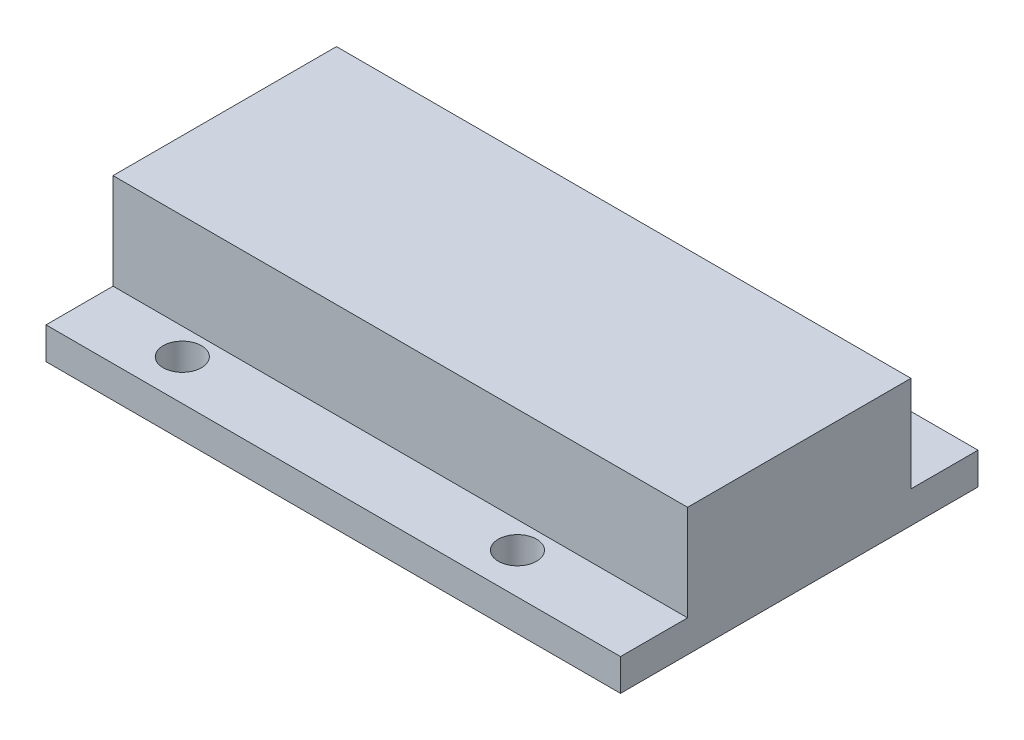
ISO-10303-21;
HEADER;
FILE_DESCRIPTION(('STEP AP214'),'2;1');
FILE_NAME('part.step','',(''),(''),'','','');
FILE_SCHEMA(('AUTOMOTIVE_DESIGN { 1 0 10303 214 1 1 1 1 }'));
ENDSEC;
DATA;
#1=APPLICATION_CONTEXT('core data for automotive mechanical design processes');
#2=APPLICATION_PROTOCOL_DEFINITION('international standard','automotive_design',2000,#1);
#3=PRODUCT_CONTEXT('',#1,'mechanical');
#4=PRODUCT('Part','Part','',(#3));
#5=PRODUCT_RELATED_PRODUCT_CATEGORY('part','',(#4));
#6=PRODUCT_DEFINITION_FORMATION('','',#4);
#7=PRODUCT_DEFINITION_CONTEXT('part definition',#1,'design');
#8=PRODUCT_DEFINITION('design','',#6,#7);
#9=PRODUCT_DEFINITION_SHAPE('','',#8);
#10=(LENGTH_UNIT() NAMED_UNIT(*) SI_UNIT(.MILLI.,.METRE.));
#11=(NAMED_UNIT(*) PLANE_ANGLE_UNIT() SI_UNIT($,.RADIAN.));
#12=(NAMED_UNIT(*) SI_UNIT($,.STERADIAN.) SOLID_ANGLE_UNIT());
#13=UNCERTAINTY_MEASURE_WITH_UNIT(LENGTH_MEASURE(1.E-05),#10,'distance_accuracy_value','');
#14=(GEOMETRIC_REPRESENTATION_CONTEXT(3) GLOBAL_UNCERTAINTY_ASSIGNED_CONTEXT((#13)) GLOBAL_UNIT_ASSIGNED_CONTEXT((#10,
#11,#12)) REPRESENTATION_CONTEXT('',''));
#15=CARTESIAN_POINT('',(0.,0.,0.));
#16=DIRECTION('',(0.,0.,1.));
#17=DIRECTION('',(1.,0.,0.));
#18=AXIS2_PLACEMENT_3D('',#15,#16,#17);
#19=CARTESIAN_POINT('',(-5.,0.,0.));
#20=DIRECTION('',(1.,0.,0.));
#21=DIRECTION('',(0.,0.,-1.));
#22=AXIS2_PLACEMENT_3D('',#19,#20,#21);
#23=CYLINDRICAL_SURFACE('',#22,1.5);
#24=CARTESIAN_POINT('',(-1.,0.,0.));
#25=DIRECTION('',(1.,0.,0.));
#26=DIRECTION('',(0.,0.,-1.));
#27=AXIS2_PLACEMENT_3D('',#24,#25,#26);
#28=CIRCLE('',#27,1.5);
#29=CARTESIAN_POINT('',(-1.,0.,-1.5));
#30=VERTEX_POINT('',#29);
#31=CARTESIAN_POINT('',(-1.,0.,1.5));
#32=VERTEX_POINT('',#31);
#33=EDGE_CURVE('E58',#30,#32,#28,.T.);
#34=ORIENTED_EDGE('',*,*,#33,.T.);
#35=DIRECTION('',(1.,0.,0.));
#36=VECTOR('',#35,1.);
#37=CARTESIAN_POINT('',(-5.,0.,1.5));
#38=LINE('',#37,#36);
#39=CARTESIAN_POINT('',(-5.,0.,1.5));
#40=VERTEX_POINT('',#39);
#41=EDGE_CURVE('E132',#40,#32,#38,.T.);
#42=ORIENTED_EDGE('',*,*,#41,.F.);
#43=CARTESIAN_POINT('',(-5.,0.,0.));
#44=DIRECTION('',(1.,0.,0.));
#45=DIRECTION('',(0.,0.,-1.));
#46=AXIS2_PLACEMENT_3D('',#43,#44,#45);
#47=CIRCLE('',#46,1.5);
#48=CARTESIAN_POINT('',(-5.,0.,-1.5));
#49=VERTEX_POINT('',#48);
#50=EDGE_CURVE('E135',#49,#40,#47,.T.);
#51=ORIENTED_EDGE('',*,*,#50,.F.);
#52=DIRECTION('',(1.,0.,0.));
#53=VECTOR('',#52,1.);
#54=CARTESIAN_POINT('',(-5.,0.,-1.5));
#55=LINE('',#54,#53);
#56=EDGE_CURVE('E53',#49,#30,#55,.T.);
#57=ORIENTED_EDGE('',*,*,#56,.T.);
#58=EDGE_LOOP('',(#34,#42,#51,#57));
#59=FACE_BOUND('',#58,.T.);
#60=ADVANCED_FACE('F36',(#59),#23,.F.);
#61=CARTESIAN_POINT('',(-18.,0.,0.));
#62=DIRECTION('',(1.,0.,0.));
#63=DIRECTION('',(0.,0.,-1.));
#64=AXIS2_PLACEMENT_3D('',#61,#62,#63);
#65=CYLINDRICAL_SURFACE('',#64,3.1);
#66=CARTESIAN_POINT('',(-5.,0.,0.));
#67=DIRECTION('',(1.,0.,0.));
#68=DIRECTION('',(0.,0.,-1.));
#69=AXIS2_PLACEMENT_3D('',#66,#67,#68);
#70=CIRCLE('',#69,3.1);
#71=CARTESIAN_POINT('',(-5.,0.,-3.1));
#72=VERTEX_POINT('',#71);
#73=CARTESIAN_POINT('',(-5.,0.,3.1));
#74=VERTEX_POINT('',#73);
#75=EDGE_CURVE('E142',#72,#74,#70,.T.);
#76=ORIENTED_EDGE('',*,*,#75,.T.);
#77=DIRECTION('',(1.,0.,0.));
#78=VECTOR('',#77,1.);
#79=CARTESIAN_POINT('',(-18.,0.,3.1));
#80=LINE('',#79,#78);
#81=CARTESIAN_POINT('',(-18.,0.,3.1));
#82=VERTEX_POINT('',#81);
#83=EDGE_CURVE('E11',#82,#74,#80,.T.);
#84=ORIENTED_EDGE('',*,*,#83,.F.);
#85=CARTESIAN_POINT('',(-18.,0.,0.));
#86=DIRECTION('',(1.,0.,0.));
#87=DIRECTION('',(0.,0.,-1.));
#88=AXIS2_PLACEMENT_3D('',#85,#86,#87);
#89=CIRCLE('',#88,3.1);
#90=CARTESIAN_POINT('',(-18.,0.,-3.1));
#91=VERTEX_POINT('',#90);
#92=EDGE_CURVE('E151',#91,#82,#89,.T.);
#93=ORIENTED_EDGE('',*,*,#92,.F.);
#94=DIRECTION('',(1.,0.,0.));
#95=VECTOR('',#94,1.);
#96=CARTESIAN_POINT('',(-18.,0.,-3.1));
#97=LINE('',#96,#95);
#98=EDGE_CURVE('E153',#91,#72,#97,.T.);
#99=ORIENTED_EDGE('',*,*,#98,.T.);
#100=EDGE_LOOP('',(#76,#84,#93,#99));
#101=FACE_BOUND('',#100,.T.);
#102=ADVANCED_FACE('F38',(#101),#65,.F.);
#103=CARTESIAN_POINT('',(-18.,0.,0.));
#104=DIRECTION('',(0.,-1.,0.));
#105=DIRECTION('',(0.,0.,-1.));
#106=AXIS2_PLACEMENT_3D('',#103,#104,#105);
#107=PLANE('',#106);
#108=CARTESIAN_POINT('',(-15.,0.,4.32953494659146));
#109=DIRECTION('',(0.,-1.,0.));
#110=DIRECTION('',(0.,0.,-1.));
#111=AXIS2_PLACEMENT_3D('',#108,#109,#110);
#112=CIRCLE('',#111,0.6);
#113=CARTESIAN_POINT('',(-15.,0.,3.72953494659146));
#114=VERTEX_POINT('',#113);
#115=EDGE_CURVE('E168',#114,#114,#112,.T.);
#116=ORIENTED_EDGE('',*,*,#115,.F.);
#117=EDGE_LOOP('',(#116));
#118=FACE_BOUND('',#117,.T.);
#119=CARTESIAN_POINT('',(-4.5,0.,4.32953494659146));
#120=DIRECTION('',(0.,-1.,0.));
#121=DIRECTION('',(0.,0.,-1.));
#122=AXIS2_PLACEMENT_3D('',#119,#120,#121);
#123=CIRCLE('',#122,0.6);
#124=CARTESIAN_POINT('',(-4.5,0.,3.72953494659146));
#125=VERTEX_POINT('',#124);
#126=EDGE_CURVE('E181',#125,#125,#123,.T.);
#127=ORIENTED_EDGE('',*,*,#126,.F.);
#128=EDGE_LOOP('',(#127));
#129=FACE_BOUND('',#128,.T.);
#130=CARTESIAN_POINT('',(-9.00000000000001,0.,-4.42046505340854));
#131=DIRECTION('',(0.,-1.,0.));
#132=DIRECTION('',(0.,0.,-1.));
#133=AXIS2_PLACEMENT_3D('',#130,#131,#132);
#134=CIRCLE('',#133,0.6);
#135=CARTESIAN_POINT('',(-9.00000000000001,0.,-5.02046505340854));
#136=VERTEX_POINT('',#135);
#137=EDGE_CURVE('E178',#136,#136,#134,.T.);
#138=ORIENTED_EDGE('',*,*,#137,.F.);
#139=EDGE_LOOP('',(#138));
#140=FACE_BOUND('',#139,.T.);
#141=DIRECTION('',(0.,0.,-1.));
#142=VECTOR('',#141,1.);
#143=CARTESIAN_POINT('',(0.,0.,0.));
#144=LINE('',#143,#142);
#145=CARTESIAN_POINT('',(0.,0.,5.6));
#146=VERTEX_POINT('',#145);
#147=CARTESIAN_POINT('',(0.,0.,-5.6));
#148=VERTEX_POINT('',#147);
#149=EDGE_CURVE('E233',#146,#148,#144,.T.);
#150=ORIENTED_EDGE('',*,*,#149,.F.);
#151=DIRECTION('',(1.,0.,0.));
#152=VECTOR('',#151,1.);
#153=CARTESIAN_POINT('',(-18.,0.,5.6));
#154=LINE('',#153,#152);
#155=CARTESIAN_POINT('',(-18.,0.,5.6));
#156=VERTEX_POINT('',#155);
#157=EDGE_CURVE('E45',#156,#146,#154,.T.);
#158=ORIENTED_EDGE('',*,*,#157,.F.);
#159=DIRECTION('',(0.,0.,-1.));
#160=VECTOR('',#159,1.);
#161=CARTESIAN_POINT('',(-18.,0.,0.));
#162=LINE('',#161,#160);
#163=EDGE_CURVE('E148',#156,#82,#162,.T.);
#164=ORIENTED_EDGE('',*,*,#163,.T.);
#165=ORIENTED_EDGE('',*,*,#83,.T.);
#166=DIRECTION('',(0.,0.,-1.));
#167=VECTOR('',#166,1.);
#168=CARTESIAN_POINT('',(-5.,0.,0.));
#169=LINE('',#168,#167);
#170=EDGE_CURVE('E133',#74,#40,#169,.T.);
#171=ORIENTED_EDGE('',*,*,#170,.T.);
#172=ORIENTED_EDGE('',*,*,#41,.T.);
#173=DIRECTION('',(0.,0.,-1.));
#174=VECTOR('',#173,1.);
#175=CARTESIAN_POINT('',(-1.,0.,0.));
#176=LINE('',#175,#174);
#177=EDGE_CURVE('E131',#32,#30,#176,.T.);
#178=ORIENTED_EDGE('',*,*,#177,.T.);
#179=ORIENTED_EDGE('',*,*,#56,.F.);
#180=EDGE_CURVE('E129',#49,#72,#169,.T.);
#181=ORIENTED_EDGE('',*,*,#180,.T.);
#182=ORIENTED_EDGE('',*,*,#98,.F.);
#183=CARTESIAN_POINT('',(-18.,0.,-5.6));
#184=VERTEX_POINT('',#183);
#185=EDGE_CURVE('E162',#91,#184,#162,.T.);
#186=ORIENTED_EDGE('',*,*,#185,.T.);
#187=DIRECTION('',(1.,0.,0.));
#188=VECTOR('',#187,1.);
#189=CARTESIAN_POINT('',(-18.,0.,-5.6));
#190=LINE('',#189,#188);
#191=EDGE_CURVE('E155',#184,#148,#190,.T.);
#192=ORIENTED_EDGE('',*,*,#191,.T.);
#193=EDGE_LOOP('',(#150,#158,#164,#165,#171,#172,#178,#179,#181,#182,#186,#192));
#194=FACE_BOUND('',#193,.T.);
#195=ADVANCED_FACE('F127',(#118,#129,#140,#194),#107,.T.);
#196=CARTESIAN_POINT('',(-18.,0.,5.6));
#197=DIRECTION('',(0.,0.,-1.));
#198=DIRECTION('',(-1.,0.,0.));
#199=AXIS2_PLACEMENT_3D('',#196,#197,#198);
#200=PLANE('',#199);
#201=DIRECTION('',(0.,1.,0.));
#202=VECTOR('',#201,1.);
#203=CARTESIAN_POINT('',(0.,0.,5.6));
#204=LINE('',#203,#202);
#205=CARTESIAN_POINT('',(0.,1.,5.6));
#206=VERTEX_POINT('',#205);
#207=EDGE_CURVE('E248',#146,#206,#204,.T.);
#208=ORIENTED_EDGE('',*,*,#207,.T.);
#209=DIRECTION('',(1.,0.,0.));
#210=VECTOR('',#209,1.);
#211=CARTESIAN_POINT('',(-18.,1.,5.6));
#212=LINE('',#211,#210);
#213=CARTESIAN_POINT('',(-18.,1.,5.6));
#214=VERTEX_POINT('',#213);
#215=EDGE_CURVE('E251',#214,#206,#212,.T.);
#216=ORIENTED_EDGE('',*,*,#215,.F.);
#217=DIRECTION('',(0.,1.,0.));
#218=VECTOR('',#217,1.);
#219=CARTESIAN_POINT('',(-18.,0.,5.6));
#220=LINE('',#219,#218);
#221=EDGE_CURVE('E160',#156,#214,#220,.T.);
#222=ORIENTED_EDGE('',*,*,#221,.F.);
#223=ORIENTED_EDGE('',*,*,#157,.T.);
#224=EDGE_LOOP('',(#208,#216,#222,#223));
#225=FACE_BOUND('',#224,.T.);
#226=ADVANCED_FACE('F192',(#225),#200,.F.);
#227=CARTESIAN_POINT('',(-18.,1.,0.));
#228=DIRECTION('',(0.,-1.,0.));
#229=DIRECTION('',(0.,0.,-1.));
#230=AXIS2_PLACEMENT_3D('',#227,#228,#229);
#231=PLANE('',#230);
#232=CARTESIAN_POINT('',(-15.,1.,4.32953494659146));
#233=DIRECTION('',(0.,-1.,0.));
#234=DIRECTION('',(0.,0.,-1.));
#235=AXIS2_PLACEMENT_3D('',#232,#233,#234);
#236=CIRCLE('',#235,0.6);
#237=CARTESIAN_POINT('',(-15.,1.,3.72953494659146));
#238=VERTEX_POINT('',#237);
#239=EDGE_CURVE('E40',#238,#238,#236,.T.);
#240=ORIENTED_EDGE('',*,*,#239,.T.);
#241=EDGE_LOOP('',(#240));
#242=FACE_BOUND('',#241,.T.);
#243=CARTESIAN_POINT('',(-4.5,1.,4.32953494659146));
#244=DIRECTION('',(0.,-1.,0.));
#245=DIRECTION('',(0.,0.,-1.));
#246=AXIS2_PLACEMENT_3D('',#243,#244,#245);
#247=CIRCLE('',#246,0.6);
#248=CARTESIAN_POINT('',(-4.5,1.,3.72953494659146));
#249=VERTEX_POINT('',#248);
#250=EDGE_CURVE('E167',#249,#249,#247,.T.);
#251=ORIENTED_EDGE('',*,*,#250,.T.);
#252=EDGE_LOOP('',(#251));
#253=FACE_BOUND('',#252,.T.);
#254=DIRECTION('',(0.,0.,-1.));
#255=VECTOR('',#254,1.);
#256=CARTESIAN_POINT('',(0.,1.,0.));
#257=LINE('',#256,#255);
#258=CARTESIAN_POINT('',(0.,1.,3.5));
#259=VERTEX_POINT('',#258);
#260=EDGE_CURVE('E245',#206,#259,#257,.T.);
#261=ORIENTED_EDGE('',*,*,#260,.T.);
#262=DIRECTION('',(1.,0.,0.));
#263=VECTOR('',#262,1.);
#264=CARTESIAN_POINT('',(-18.,1.,3.5));
#265=LINE('',#264,#263);
#266=CARTESIAN_POINT('',(-18.,1.,3.5));
#267=VERTEX_POINT('',#266);
#268=EDGE_CURVE('E254',#267,#259,#265,.T.);
#269=ORIENTED_EDGE('',*,*,#268,.F.);
#270=DIRECTION('',(0.,0.,-1.));
#271=VECTOR('',#270,1.);
#272=CARTESIAN_POINT('',(-18.,1.,0.));
#273=LINE('',#272,#271);
#274=EDGE_CURVE('E292',#214,#267,#273,.T.);
#275=ORIENTED_EDGE('',*,*,#274,.F.);
#276=ORIENTED_EDGE('',*,*,#215,.T.);
#277=EDGE_LOOP('',(#261,#269,#275,#276));
#278=FACE_BOUND('',#277,.T.);
#279=ADVANCED_FACE('F278',(#242,#253,#278),#231,.F.);
#280=CARTESIAN_POINT('',(-18.,0.,3.5));
#281=DIRECTION('',(0.,0.,1.));
#282=DIRECTION('',(0.,-1.,0.));
#283=AXIS2_PLACEMENT_3D('',#280,#281,#282);
#284=PLANE('',#283);
#285=DIRECTION('',(0.,-1.,0.));
#286=VECTOR('',#285,1.);
#287=CARTESIAN_POINT('',(0.,0.,3.5));
#288=LINE('',#287,#286);
#289=CARTESIAN_POINT('',(0.,4.,3.5));
#290=VERTEX_POINT('',#289);
#291=EDGE_CURVE('E242',#290,#259,#288,.T.);
#292=ORIENTED_EDGE('',*,*,#291,.F.);
#293=DIRECTION('',(1.,0.,0.));
#294=VECTOR('',#293,1.);
#295=CARTESIAN_POINT('',(-18.,4.,3.5));
#296=LINE('',#295,#294);
#297=CARTESIAN_POINT('',(-18.,4.,3.5));
#298=VERTEX_POINT('',#297);
#299=EDGE_CURVE('E256',#298,#290,#296,.T.);
#300=ORIENTED_EDGE('',*,*,#299,.F.);
#301=DIRECTION('',(0.,-1.,0.));
#302=VECTOR('',#301,1.);
#303=CARTESIAN_POINT('',(-18.,0.,3.5));
#304=LINE('',#303,#302);
#305=EDGE_CURVE('E275',#298,#267,#304,.T.);
#306=ORIENTED_EDGE('',*,*,#305,.T.);
#307=ORIENTED_EDGE('',*,*,#268,.T.);
#308=EDGE_LOOP('',(#292,#300,#306,#307));
#309=FACE_BOUND('',#308,.T.);
#310=ADVANCED_FACE('F271',(#309),#284,.T.);
#311=CARTESIAN_POINT('',(-18.,4.,0.));
#312=DIRECTION('',(0.,-1.,0.));
#313=DIRECTION('',(0.,0.,-1.));
#314=AXIS2_PLACEMENT_3D('',#311,#312,#313);
#315=PLANE('',#314);
#316=DIRECTION('',(0.,0.,-1.));
#317=VECTOR('',#316,1.);
#318=CARTESIAN_POINT('',(0.,4.,0.));
#319=LINE('',#318,#317);
#320=CARTESIAN_POINT('',(0.,4.,-3.5));
#321=VERTEX_POINT('',#320);
#322=EDGE_CURVE('E240',#290,#321,#319,.T.);
#323=ORIENTED_EDGE('',*,*,#322,.T.);
#324=DIRECTION('',(1.,0.,0.));
#325=VECTOR('',#324,1.);
#326=CARTESIAN_POINT('',(-18.,4.,-3.5));
#327=LINE('',#326,#325);
#328=CARTESIAN_POINT('',(-18.,4.,-3.5));
#329=VERTEX_POINT('',#328);
#330=EDGE_CURVE('E258',#329,#321,#327,.T.);
#331=ORIENTED_EDGE('',*,*,#330,.F.);
#332=DIRECTION('',(0.,0.,-1.));
#333=VECTOR('',#332,1.);
#334=CARTESIAN_POINT('',(-18.,4.,0.));
#335=LINE('',#334,#333);
#336=EDGE_CURVE('E289',#298,#329,#335,.T.);
#337=ORIENTED_EDGE('',*,*,#336,.F.);
#338=ORIENTED_EDGE('',*,*,#299,.T.);
#339=EDGE_LOOP('',(#323,#331,#337,#338));
#340=FACE_BOUND('',#339,.T.);
#341=ADVANCED_FACE('F399',(#340),#315,.F.);
#342=CARTESIAN_POINT('',(-18.,0.,-3.5));
#343=DIRECTION('',(0.,0.,1.));
#344=DIRECTION('',(0.,-1.,0.));
#345=AXIS2_PLACEMENT_3D('',#342,#343,#344);
#346=PLANE('',#345);
#347=DIRECTION('',(0.,-1.,0.));
#348=VECTOR('',#347,1.);
#349=CARTESIAN_POINT('',(0.,0.,-3.5));
#350=LINE('',#349,#348);
#351=CARTESIAN_POINT('',(0.,1.,-3.5));
#352=VERTEX_POINT('',#351);
#353=EDGE_CURVE('E224',#321,#352,#350,.T.);
#354=ORIENTED_EDGE('',*,*,#353,.T.);
#355=DIRECTION('',(1.,0.,0.));
#356=VECTOR('',#355,1.);
#357=CARTESIAN_POINT('',(-18.,1.,-3.5));
#358=LINE('',#357,#356);
#359=CARTESIAN_POINT('',(-18.,1.,-3.5));
#360=VERTEX_POINT('',#359);
#361=EDGE_CURVE('E220',#360,#352,#358,.T.);
#362=ORIENTED_EDGE('',*,*,#361,.F.);
#363=DIRECTION('',(0.,-1.,0.));
#364=VECTOR('',#363,1.);
#365=CARTESIAN_POINT('',(-18.,0.,-3.5));
#366=LINE('',#365,#364);
#367=EDGE_CURVE('E264',#329,#360,#366,.T.);
#368=ORIENTED_EDGE('',*,*,#367,.F.);
#369=ORIENTED_EDGE('',*,*,#330,.T.);
#370=EDGE_LOOP('',(#354,#362,#368,#369));
#371=FACE_BOUND('',#370,.T.);
#372=ADVANCED_FACE('F210',(#371),#346,.F.);
#373=CARTESIAN_POINT('',(-18.,0.999999999999997,0.));
#374=DIRECTION('',(0.,-1.,0.));
#375=DIRECTION('',(0.,0.,-1.));
#376=AXIS2_PLACEMENT_3D('',#373,#374,#375);
#377=PLANE('',#376);
#378=CARTESIAN_POINT('',(-9.00000000000001,1.,-4.42046505340854));
#379=DIRECTION('',(0.,-1.,0.));
#380=DIRECTION('',(0.,0.,-1.));
#381=AXIS2_PLACEMENT_3D('',#378,#379,#380);
#382=CIRCLE('',#381,0.6);
#383=CARTESIAN_POINT('',(-9.00000000000001,1.,-5.02046505340854));
#384=VERTEX_POINT('',#383);
#385=EDGE_CURVE('E165',#384,#384,#382,.T.);
#386=ORIENTED_EDGE('',*,*,#385,.T.);
#387=EDGE_LOOP('',(#386));
#388=FACE_BOUND('',#387,.T.);
#389=DIRECTION('',(0.,0.,-1.));
#390=VECTOR('',#389,1.);
#391=CARTESIAN_POINT('',(0.,0.999999999999997,0.));
#392=LINE('',#391,#390);
#393=CARTESIAN_POINT('',(0.,1.,-5.6));
#394=VERTEX_POINT('',#393);
#395=EDGE_CURVE('E215',#352,#394,#392,.T.);
#396=ORIENTED_EDGE('',*,*,#395,.T.);
#397=DIRECTION('',(1.,0.,0.));
#398=VECTOR('',#397,1.);
#399=CARTESIAN_POINT('',(-18.,1.,-5.6));
#400=LINE('',#399,#398);
#401=CARTESIAN_POINT('',(-18.,1.,-5.6));
#402=VERTEX_POINT('',#401);
#403=EDGE_CURVE('E158',#402,#394,#400,.T.);
#404=ORIENTED_EDGE('',*,*,#403,.F.);
#405=DIRECTION('',(0.,0.,-1.));
#406=VECTOR('',#405,1.);
#407=CARTESIAN_POINT('',(-18.,0.999999999999997,0.));
#408=LINE('',#407,#406);
#409=EDGE_CURVE('E286',#360,#402,#408,.T.);
#410=ORIENTED_EDGE('',*,*,#409,.F.);
#411=ORIENTED_EDGE('',*,*,#361,.T.);
#412=EDGE_LOOP('',(#396,#404,#410,#411));
#413=FACE_BOUND('',#412,.T.);
#414=ADVANCED_FACE('F206',(#388,#413),#377,.F.);
#415=CARTESIAN_POINT('',(-18.,0.,-5.6));
#416=DIRECTION('',(0.,0.,1.));
#417=DIRECTION('',(1.,0.,0.));
#418=AXIS2_PLACEMENT_3D('',#415,#416,#417);
#419=PLANE('',#418);
#420=DIRECTION('',(0.,-1.,0.));
#421=VECTOR('',#420,1.);
#422=CARTESIAN_POINT('',(0.,0.,-5.6));
#423=LINE('',#422,#421);
#424=EDGE_CURVE('E225',#394,#148,#423,.T.);
#425=ORIENTED_EDGE('',*,*,#424,.T.);
#426=ORIENTED_EDGE('',*,*,#191,.F.);
#427=DIRECTION('',(0.,-1.,0.));
#428=VECTOR('',#427,1.);
#429=CARTESIAN_POINT('',(-18.,0.,-5.6));
#430=LINE('',#429,#428);
#431=EDGE_CURVE('E230',#402,#184,#430,.T.);
#432=ORIENTED_EDGE('',*,*,#431,.F.);
#433=ORIENTED_EDGE('',*,*,#403,.T.);
#434=EDGE_LOOP('',(#425,#426,#432,#433));
#435=FACE_BOUND('',#434,.T.);
#436=ADVANCED_FACE('F209',(#435),#419,.F.);
#437=CARTESIAN_POINT('',(-18.,0.,0.));
#438=DIRECTION('',(1.,0.,0.));
#439=DIRECTION('',(0.,0.,-1.));
#440=AXIS2_PLACEMENT_3D('',#437,#438,#439);
#441=PLANE('',#440);
#442=ORIENTED_EDGE('',*,*,#92,.T.);
#443=ORIENTED_EDGE('',*,*,#163,.F.);
#444=ORIENTED_EDGE('',*,*,#221,.T.);
#445=ORIENTED_EDGE('',*,*,#274,.T.);
#446=ORIENTED_EDGE('',*,*,#305,.F.);
#447=ORIENTED_EDGE('',*,*,#336,.T.);
#448=ORIENTED_EDGE('',*,*,#367,.T.);
#449=ORIENTED_EDGE('',*,*,#409,.T.);
#450=ORIENTED_EDGE('',*,*,#431,.T.);
#451=ORIENTED_EDGE('',*,*,#185,.F.);
#452=EDGE_LOOP('',(#442,#443,#444,#445,#446,#447,#448,#449,#450,#451));
#453=FACE_BOUND('',#452,.T.);
#454=ADVANCED_FACE('F293',(#453),#441,.F.);
#455=CARTESIAN_POINT('',(0.,0.,0.));
#456=DIRECTION('',(1.,0.,0.));
#457=DIRECTION('',(0.,0.,-1.));
#458=AXIS2_PLACEMENT_3D('',#455,#456,#457);
#459=PLANE('',#458);
#460=ORIENTED_EDGE('',*,*,#149,.T.);
#461=ORIENTED_EDGE('',*,*,#424,.F.);
#462=ORIENTED_EDGE('',*,*,#395,.F.);
#463=ORIENTED_EDGE('',*,*,#353,.F.);
#464=ORIENTED_EDGE('',*,*,#322,.F.);
#465=ORIENTED_EDGE('',*,*,#291,.T.);
#466=ORIENTED_EDGE('',*,*,#260,.F.);
#467=ORIENTED_EDGE('',*,*,#207,.F.);
#468=EDGE_LOOP('',(#460,#461,#462,#463,#464,#465,#466,#467));
#469=FACE_BOUND('',#468,.T.);
#470=ADVANCED_FACE('F231',(#469),#459,.T.);
#471=CARTESIAN_POINT('',(-5.,0.,0.));
#472=DIRECTION('',(1.,0.,0.));
#473=DIRECTION('',(0.,0.,-1.));
#474=AXIS2_PLACEMENT_3D('',#471,#472,#473);
#475=PLANE('',#474);
#476=ORIENTED_EDGE('',*,*,#50,.T.);
#477=ORIENTED_EDGE('',*,*,#170,.F.);
#478=ORIENTED_EDGE('',*,*,#75,.F.);
#479=ORIENTED_EDGE('',*,*,#180,.F.);
#480=EDGE_LOOP('',(#476,#477,#478,#479));
#481=FACE_BOUND('',#480,.T.);
#482=ADVANCED_FACE('F141',(#481),#475,.F.);
#483=CARTESIAN_POINT('',(-1.,0.,0.));
#484=DIRECTION('',(1.,0.,0.));
#485=DIRECTION('',(0.,0.,-1.));
#486=AXIS2_PLACEMENT_3D('',#483,#484,#485);
#487=PLANE('',#486);
#488=ORIENTED_EDGE('',*,*,#177,.F.);
#489=ORIENTED_EDGE('',*,*,#33,.F.);
#490=EDGE_LOOP('',(#488,#489));
#491=FACE_BOUND('',#490,.T.);
#492=ADVANCED_FACE('F202',(#491),#487,.F.);
#493=CARTESIAN_POINT('',(-9.00000000000001,4.,-4.42046505340854));
#494=DIRECTION('',(0.,-1.,0.));
#495=DIRECTION('',(0.,0.,-1.));
#496=AXIS2_PLACEMENT_3D('',#493,#494,#495);
#497=CYLINDRICAL_SURFACE('',#496,0.6);
#498=ORIENTED_EDGE('',*,*,#137,.T.);
#499=EDGE_LOOP('',(#498));
#500=FACE_BOUND('',#499,.T.);
#501=ORIENTED_EDGE('',*,*,#385,.F.);
#502=EDGE_LOOP('',(#501));
#503=FACE_BOUND('',#502,.T.);
#504=ADVANCED_FACE('F198',(#500,#503),#497,.F.);
#505=CARTESIAN_POINT('',(-4.5,4.,4.32953494659146));
#506=DIRECTION('',(0.,-1.,0.));
#507=DIRECTION('',(0.,0.,-1.));
#508=AXIS2_PLACEMENT_3D('',#505,#506,#507);
#509=CYLINDRICAL_SURFACE('',#508,0.6);
#510=ORIENTED_EDGE('',*,*,#126,.T.);
#511=EDGE_LOOP('',(#510));
#512=FACE_BOUND('',#511,.T.);
#513=ORIENTED_EDGE('',*,*,#250,.F.);
#514=EDGE_LOOP('',(#513));
#515=FACE_BOUND('',#514,.T.);
#516=ADVANCED_FACE('F201',(#512,#515),#509,.F.);
#517=CARTESIAN_POINT('',(-15.,4.,4.32953494659146));
#518=DIRECTION('',(0.,-1.,0.));
#519=DIRECTION('',(0.,0.,-1.));
#520=AXIS2_PLACEMENT_3D('',#517,#518,#519);
#521=CYLINDRICAL_SURFACE('',#520,0.6);
#522=ORIENTED_EDGE('',*,*,#115,.T.);
#523=EDGE_LOOP('',(#522));
#524=FACE_BOUND('',#523,.T.);
#525=ORIENTED_EDGE('',*,*,#239,.F.);
#526=EDGE_LOOP('',(#525));
#527=FACE_BOUND('',#526,.T.);
#528=ADVANCED_FACE('F187',(#524,#527),#521,.F.);
#529=CLOSED_SHELL('',(#60,#102,#195,#226,#279,#310,#341,#372,#414,#436,#454,#470,#482,#492,#504,
#516,#528));
#530=MANIFOLD_SOLID_BREP('B2',#529);
#531=ADVANCED_BREP_SHAPE_REPRESENTATION('',(#18,#530),#14);
#532=SHAPE_DEFINITION_REPRESENTATION(#9,#531);
ENDSEC;
END-ISO-10303-21;
